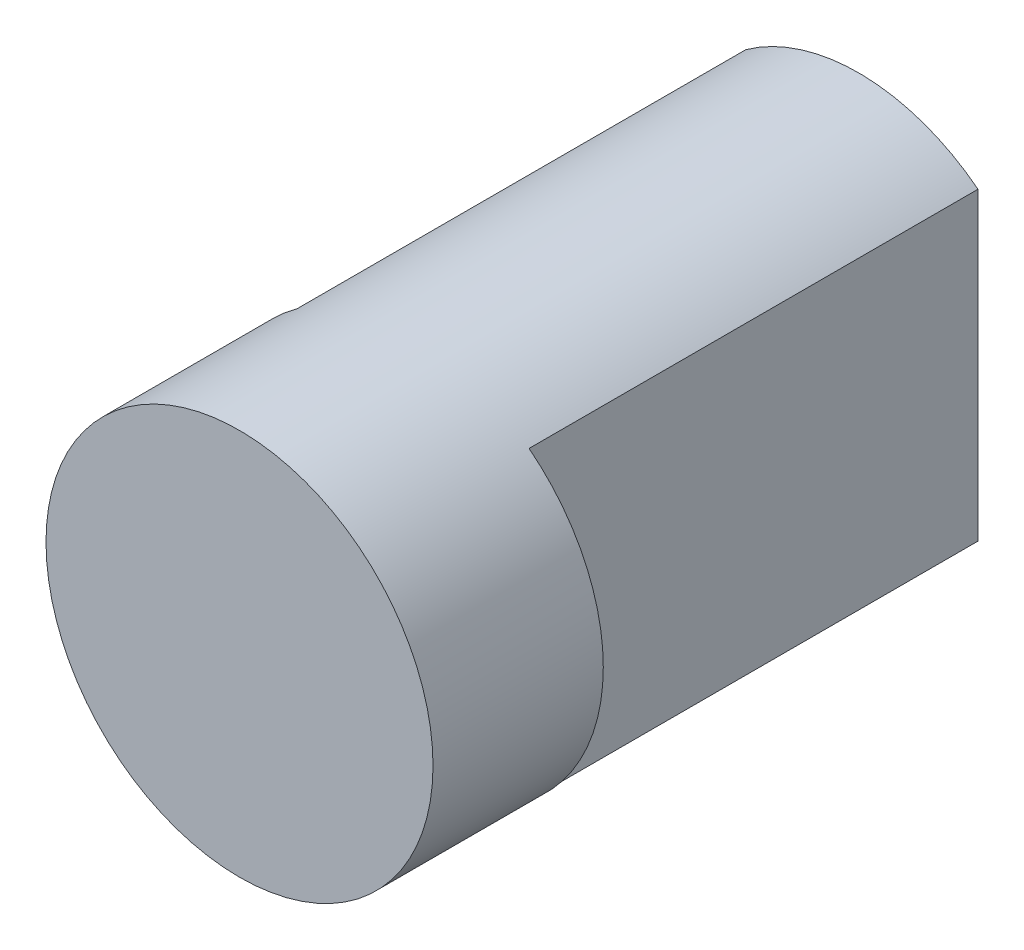
ISO-10303-21;
HEADER;
FILE_DESCRIPTION(('STEP AP214'),'2;1');
FILE_NAME('part.step','',(''),(''),'','','');
FILE_SCHEMA(('AUTOMOTIVE_DESIGN { 1 0 10303 214 1 1 1 1 }'));
ENDSEC;
DATA;
#1=APPLICATION_CONTEXT('core data for automotive mechanical design processes');
#2=APPLICATION_PROTOCOL_DEFINITION('international standard','automotive_design',2000,#1);
#3=PRODUCT_CONTEXT('',#1,'mechanical');
#4=PRODUCT('Part','Part','',(#3));
#5=PRODUCT_RELATED_PRODUCT_CATEGORY('part','',(#4));
#6=PRODUCT_DEFINITION_FORMATION('','',#4);
#7=PRODUCT_DEFINITION_CONTEXT('part definition',#1,'design');
#8=PRODUCT_DEFINITION('design','',#6,#7);
#9=PRODUCT_DEFINITION_SHAPE('','',#8);
#10=(LENGTH_UNIT() NAMED_UNIT(*) SI_UNIT(.MILLI.,.METRE.));
#11=(NAMED_UNIT(*) PLANE_ANGLE_UNIT() SI_UNIT($,.RADIAN.));
#12=(NAMED_UNIT(*) SI_UNIT($,.STERADIAN.) SOLID_ANGLE_UNIT());
#13=UNCERTAINTY_MEASURE_WITH_UNIT(LENGTH_MEASURE(1.E-05),#10,'distance_accuracy_value','');
#14=(GEOMETRIC_REPRESENTATION_CONTEXT(3) GLOBAL_UNCERTAINTY_ASSIGNED_CONTEXT((#13)) GLOBAL_UNIT_ASSIGNED_CONTEXT((#10,
#11,#12)) REPRESENTATION_CONTEXT('',''));
#15=CARTESIAN_POINT('',(0.,0.,0.));
#16=DIRECTION('',(0.,0.,1.));
#17=DIRECTION('',(1.,0.,0.));
#18=AXIS2_PLACEMENT_3D('',#15,#16,#17);
#19=CARTESIAN_POINT('',(50.0234966452764,46.5025884499282,-3.61479041666102));
#20=DIRECTION('',(0.,0.,1.));
#21=DIRECTION('',(1.,0.,0.));
#22=AXIS2_PLACEMENT_3D('',#19,#20,#21);
#23=CYLINDRICAL_SURFACE('',#22,2.5);
#24=CARTESIAN_POINT('',(50.0234966452764,46.5025884499282,-3.61479041666102));
#25=DIRECTION('',(0.,0.,-1.));
#26=DIRECTION('',(-1.,0.,0.));
#27=AXIS2_PLACEMENT_3D('',#24,#25,#26);
#28=CIRCLE('',#27,2.5);
#29=CARTESIAN_POINT('',(51.5645282113704,44.5340301672497,-3.61479041666102));
#30=VERTEX_POINT('',#29);
#31=CARTESIAN_POINT('',(48.5645282113704,44.4724625649482,-3.61479041666102));
#32=VERTEX_POINT('',#31);
#33=EDGE_CURVE('E47',#30,#32,#28,.T.);
#34=ORIENTED_EDGE('',*,*,#33,.F.);
#35=DIRECTION('',(0.,0.,-1.));
#36=VECTOR('',#35,1.);
#37=CARTESIAN_POINT('',(51.5645282113704,44.5340301672497,2.18520958333898));
#38=LINE('',#37,#36);
#39=CARTESIAN_POINT('',(51.5645282113704,44.5340301672497,2.18520958333898));
#40=VERTEX_POINT('',#39);
#41=EDGE_CURVE('E54',#40,#30,#38,.T.);
#42=ORIENTED_EDGE('',*,*,#41,.F.);
#43=CARTESIAN_POINT('',(50.0234966452764,46.5025884499282,2.18520958333898));
#44=DIRECTION('',(0.,0.,-1.));
#45=DIRECTION('',(-1.,0.,0.));
#46=AXIS2_PLACEMENT_3D('',#43,#44,#45);
#47=CIRCLE('',#46,2.5);
#48=CARTESIAN_POINT('',(51.5645282113704,48.4711467326066,2.18520958333898));
#49=VERTEX_POINT('',#48);
#50=EDGE_CURVE('E82',#49,#40,#47,.T.);
#51=ORIENTED_EDGE('',*,*,#50,.F.);
#52=DIRECTION('',(0.,0.,-1.));
#53=VECTOR('',#52,1.);
#54=CARTESIAN_POINT('',(51.5645282113704,48.4711467326066,2.18520958333898));
#55=LINE('',#54,#53);
#56=CARTESIAN_POINT('',(51.5645282113704,48.4711467326066,-3.61479041666102));
#57=VERTEX_POINT('',#56);
#58=EDGE_CURVE('E90',#49,#57,#55,.T.);
#59=ORIENTED_EDGE('',*,*,#58,.T.);
#60=CARTESIAN_POINT('',(48.5645282113704,48.5327143349082,-3.61479041666102));
#61=VERTEX_POINT('',#60);
#62=EDGE_CURVE('E11',#61,#57,#28,.T.);
#63=ORIENTED_EDGE('',*,*,#62,.F.);
#64=DIRECTION('',(0.,0.,-1.));
#65=VECTOR('',#64,1.);
#66=CARTESIAN_POINT('',(48.5645282113704,48.5327143349082,2.18520958333898));
#67=LINE('',#66,#65);
#68=CARTESIAN_POINT('',(48.5645282113704,48.5327143349082,2.18520958333898));
#69=VERTEX_POINT('',#68);
#70=EDGE_CURVE('E62',#69,#61,#67,.T.);
#71=ORIENTED_EDGE('',*,*,#70,.F.);
#72=CARTESIAN_POINT('',(50.0234966452764,46.5025884499282,2.18520958333898));
#73=DIRECTION('',(0.,0.,-1.));
#74=DIRECTION('',(-1.,0.,0.));
#75=AXIS2_PLACEMENT_3D('',#72,#73,#74);
#76=CIRCLE('',#75,2.50000000000001);
#77=CARTESIAN_POINT('',(48.5645282113704,44.4724625649482,2.18520958333898));
#78=VERTEX_POINT('',#77);
#79=EDGE_CURVE('E106',#78,#69,#76,.T.);
#80=ORIENTED_EDGE('',*,*,#79,.F.);
#81=DIRECTION('',(0.,0.,-1.));
#82=VECTOR('',#81,1.);
#83=CARTESIAN_POINT('',(48.5645282113704,44.4724625649482,2.18520958333898));
#84=LINE('',#83,#82);
#85=EDGE_CURVE('E102',#78,#32,#84,.T.);
#86=ORIENTED_EDGE('',*,*,#85,.T.);
#87=EDGE_LOOP('',(#34,#42,#51,#59,#63,#71,#80,#86));
#88=FACE_BOUND('',#87,.T.);
#89=CARTESIAN_POINT('',(50.0234966452764,46.5025884499282,4.38520958333898));
#90=DIRECTION('',(0.,0.,-1.));
#91=DIRECTION('',(-1.,0.,0.));
#92=AXIS2_PLACEMENT_3D('',#89,#90,#91);
#93=CIRCLE('',#92,2.5);
#94=CARTESIAN_POINT('',(47.5234966452764,46.5025884499282,4.38520958333898));
#95=VERTEX_POINT('',#94);
#96=EDGE_CURVE('E42',#95,#95,#93,.T.);
#97=ORIENTED_EDGE('',*,*,#96,.T.);
#98=EDGE_LOOP('',(#97));
#99=FACE_BOUND('',#98,.T.);
#100=ADVANCED_FACE('F39',(#88,#99),#23,.T.);
#101=CARTESIAN_POINT('',(50.0234966452764,46.5025884499282,-3.61479041666102));
#102=DIRECTION('',(0.,0.,-1.));
#103=DIRECTION('',(-1.,0.,0.));
#104=AXIS2_PLACEMENT_3D('',#101,#102,#103);
#105=PLANE('',#104);
#106=DIRECTION('',(0.,1.,0.));
#107=VECTOR('',#106,1.);
#108=CARTESIAN_POINT('',(51.5645282113704,48.4711467326066,-3.61479041666102));
#109=LINE('',#108,#107);
#110=EDGE_CURVE('E87',#30,#57,#109,.T.);
#111=ORIENTED_EDGE('',*,*,#110,.F.);
#112=ORIENTED_EDGE('',*,*,#33,.T.);
#113=DIRECTION('',(0.,-1.,0.));
#114=VECTOR('',#113,1.);
#115=CARTESIAN_POINT('',(48.5645282113704,48.5327143349082,-3.61479041666102));
#116=LINE('',#115,#114);
#117=EDGE_CURVE('E104',#61,#32,#116,.T.);
#118=ORIENTED_EDGE('',*,*,#117,.F.);
#119=ORIENTED_EDGE('',*,*,#62,.T.);
#120=EDGE_LOOP('',(#111,#112,#118,#119));
#121=FACE_BOUND('',#120,.T.);
#122=ADVANCED_FACE('F115',(#121),#105,.T.);
#123=CARTESIAN_POINT('',(50.0234966452764,46.5025884499282,4.38520958333898));
#124=DIRECTION('',(0.,0.,-1.));
#125=DIRECTION('',(-1.,0.,0.));
#126=AXIS2_PLACEMENT_3D('',#123,#124,#125);
#127=PLANE('',#126);
#128=ORIENTED_EDGE('',*,*,#96,.F.);
#129=EDGE_LOOP('',(#128));
#130=FACE_BOUND('',#129,.T.);
#131=ADVANCED_FACE('F119',(#130),#127,.F.);
#132=CARTESIAN_POINT('',(48.5645282113704,48.5327143349082,2.18520958333898));
#133=DIRECTION('',(1.,0.,0.));
#134=DIRECTION('',(0.,0.,-1.));
#135=AXIS2_PLACEMENT_3D('',#132,#133,#134);
#136=PLANE('',#135);
#137=ORIENTED_EDGE('',*,*,#117,.T.);
#138=ORIENTED_EDGE('',*,*,#85,.F.);
#139=DIRECTION('',(0.,-1.,0.));
#140=VECTOR('',#139,1.);
#141=CARTESIAN_POINT('',(48.5645282113704,48.5327143349082,2.18520958333898));
#142=LINE('',#141,#140);
#143=EDGE_CURVE('E101',#69,#78,#142,.T.);
#144=ORIENTED_EDGE('',*,*,#143,.F.);
#145=ORIENTED_EDGE('',*,*,#70,.T.);
#146=EDGE_LOOP('',(#137,#138,#144,#145));
#147=FACE_BOUND('',#146,.T.);
#148=ADVANCED_FACE('F112',(#147),#136,.F.);
#149=CARTESIAN_POINT('',(50.0234966452764,46.5025884499282,2.18520958333898));
#150=DIRECTION('',(0.,0.,-1.));
#151=DIRECTION('',(-1.,0.,0.));
#152=AXIS2_PLACEMENT_3D('',#149,#150,#151);
#153=PLANE('',#152);
#154=ORIENTED_EDGE('',*,*,#79,.T.);
#155=ORIENTED_EDGE('',*,*,#143,.T.);
#156=EDGE_LOOP('',(#154,#155));
#157=FACE_BOUND('',#156,.T.);
#158=ADVANCED_FACE('F111',(#157),#153,.T.);
#159=CARTESIAN_POINT('',(51.5645282113704,48.4711467326066,2.18520958333898));
#160=DIRECTION('',(-1.,0.,0.));
#161=DIRECTION('',(0.,0.,1.));
#162=AXIS2_PLACEMENT_3D('',#159,#160,#161);
#163=PLANE('',#162);
#164=ORIENTED_EDGE('',*,*,#110,.T.);
#165=ORIENTED_EDGE('',*,*,#58,.F.);
#166=DIRECTION('',(0.,1.,0.));
#167=VECTOR('',#166,1.);
#168=CARTESIAN_POINT('',(51.5645282113704,48.4711467326066,2.18520958333898));
#169=LINE('',#168,#167);
#170=EDGE_CURVE('E84',#40,#49,#169,.T.);
#171=ORIENTED_EDGE('',*,*,#170,.F.);
#172=ORIENTED_EDGE('',*,*,#41,.T.);
#173=EDGE_LOOP('',(#164,#165,#171,#172));
#174=FACE_BOUND('',#173,.T.);
#175=ADVANCED_FACE('F89',(#174),#163,.F.);
#176=CARTESIAN_POINT('',(50.0234966452764,46.5025884499282,2.18520958333898));
#177=DIRECTION('',(0.,0.,-1.));
#178=DIRECTION('',(-1.,0.,0.));
#179=AXIS2_PLACEMENT_3D('',#176,#177,#178);
#180=PLANE('',#179);
#181=ORIENTED_EDGE('',*,*,#50,.T.);
#182=ORIENTED_EDGE('',*,*,#170,.T.);
#183=EDGE_LOOP('',(#181,#182));
#184=FACE_BOUND('',#183,.T.);
#185=ADVANCED_FACE('F83',(#184),#180,.T.);
#186=CLOSED_SHELL('',(#100,#122,#131,#148,#158,#175,#185));
#187=MANIFOLD_SOLID_BREP('B2',#186);
#188=ADVANCED_BREP_SHAPE_REPRESENTATION('',(#18,#187),#14);
#189=SHAPE_DEFINITION_REPRESENTATION(#9,#188);
ENDSEC;
END-ISO-10303-21;
